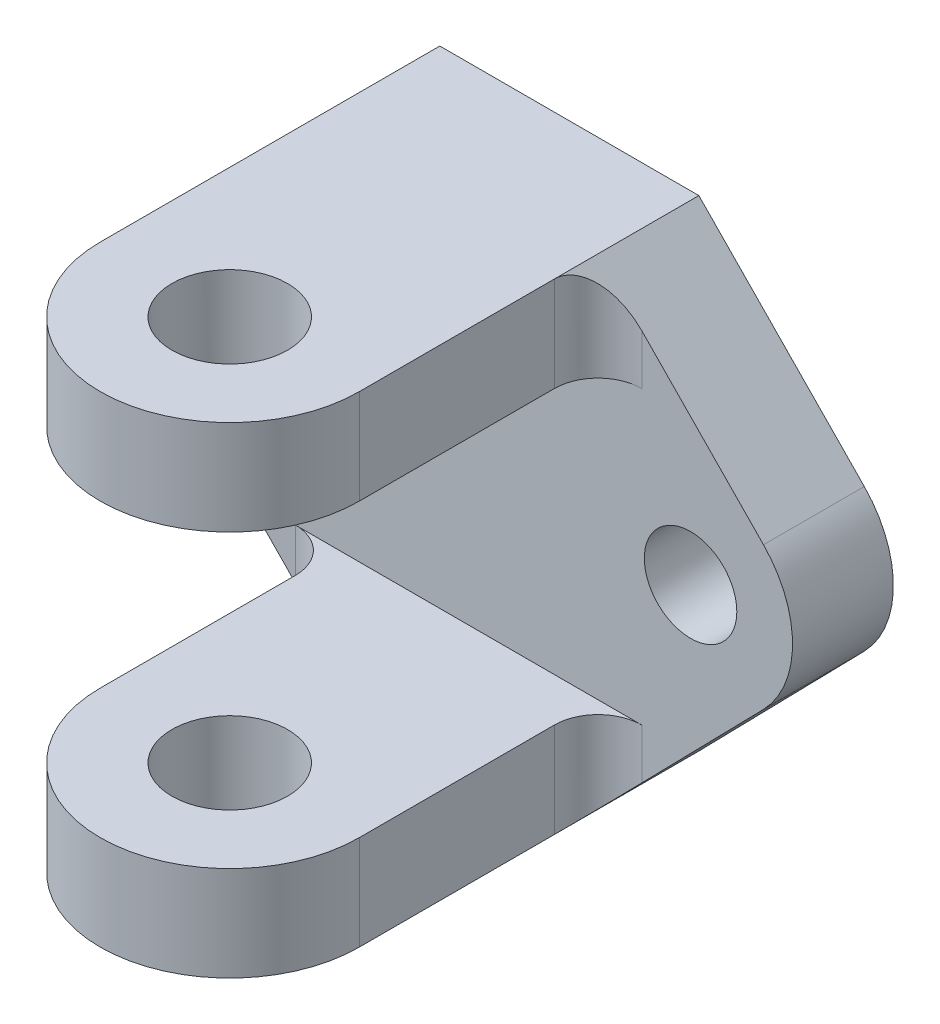
ISO-10303-21;
HEADER;
FILE_DESCRIPTION(('STEP AP214'),'2;1');
FILE_NAME('part.step','',(''),(''),'','','');
FILE_SCHEMA(('AUTOMOTIVE_DESIGN { 1 0 10303 214 1 1 1 1 }'));
ENDSEC;
DATA;
#1=APPLICATION_CONTEXT('core data for automotive mechanical design processes');
#2=APPLICATION_PROTOCOL_DEFINITION('international standard','automotive_design',2000,#1);
#3=PRODUCT_CONTEXT('',#1,'mechanical');
#4=PRODUCT('Part','Part','',(#3));
#5=PRODUCT_RELATED_PRODUCT_CATEGORY('part','',(#4));
#6=PRODUCT_DEFINITION_FORMATION('','',#4);
#7=PRODUCT_DEFINITION_CONTEXT('part definition',#1,'design');
#8=PRODUCT_DEFINITION('design','',#6,#7);
#9=PRODUCT_DEFINITION_SHAPE('','',#8);
#10=(LENGTH_UNIT() NAMED_UNIT(*) SI_UNIT(.MILLI.,.METRE.));
#11=(NAMED_UNIT(*) PLANE_ANGLE_UNIT() SI_UNIT($,.RADIAN.));
#12=(NAMED_UNIT(*) SI_UNIT($,.STERADIAN.) SOLID_ANGLE_UNIT());
#13=UNCERTAINTY_MEASURE_WITH_UNIT(LENGTH_MEASURE(1.E-05),#10,'distance_accuracy_value','');
#14=(GEOMETRIC_REPRESENTATION_CONTEXT(3) GLOBAL_UNCERTAINTY_ASSIGNED_CONTEXT((#13)) GLOBAL_UNIT_ASSIGNED_CONTEXT((#10,
#11,#12)) REPRESENTATION_CONTEXT('',''));
#15=CARTESIAN_POINT('',(0.,0.,0.));
#16=DIRECTION('',(0.,0.,1.));
#17=DIRECTION('',(1.,0.,0.));
#18=AXIS2_PLACEMENT_3D('',#15,#16,#17);
#19=CARTESIAN_POINT('',(-8.89,-87.0039032824825,0.));
#20=DIRECTION('',(1.,0.,0.));
#21=DIRECTION('',(0.,0.,-1.));
#22=AXIS2_PLACEMENT_3D('',#19,#20,#21);
#23=PLANE('',#22);
#24=DIRECTION('',(0.,0.,1.));
#25=VECTOR('',#24,1.);
#26=CARTESIAN_POINT('',(-8.89,16.51,0.));
#27=LINE('',#26,#25);
#28=CARTESIAN_POINT('',(-8.89,16.51,12.46));
#29=VERTEX_POINT('',#28);
#30=CARTESIAN_POINT('',(-8.89,16.51,25.8481308));
#31=VERTEX_POINT('',#30);
#32=EDGE_CURVE('E150',#29,#31,#27,.T.);
#33=ORIENTED_EDGE('',*,*,#32,.F.);
#34=DIRECTION('',(0.,1.,0.));
#35=VECTOR('',#34,1.);
#36=CARTESIAN_POINT('',(-8.89,9.99999999999999,12.46));
#37=LINE('',#36,#35);
#38=CARTESIAN_POINT('',(-8.89,10.,12.46));
#39=VERTEX_POINT('',#38);
#40=EDGE_CURVE('E143',#29,#39,#37,.F.);
#41=ORIENTED_EDGE('',*,*,#40,.T.);
#42=DIRECTION('',(0.,0.,-1.));
#43=VECTOR('',#42,1.);
#44=CARTESIAN_POINT('',(-8.88999999999999,10.,62.46));
#45=LINE('',#44,#43);
#46=CARTESIAN_POINT('',(-8.89,9.99999999999999,25.8481308));
#47=VERTEX_POINT('',#46);
#48=EDGE_CURVE('E147',#47,#39,#45,.T.);
#49=ORIENTED_EDGE('',*,*,#48,.F.);
#50=DIRECTION('',(0.,1.,0.));
#51=VECTOR('',#50,1.);
#52=CARTESIAN_POINT('',(-8.89,-87.0039032824825,25.8481308));
#53=LINE('',#52,#51);
#54=EDGE_CURVE('E296',#47,#31,#53,.T.);
#55=ORIENTED_EDGE('',*,*,#54,.T.);
#56=EDGE_LOOP('',(#33,#41,#49,#55));
#57=FACE_BOUND('',#56,.T.);
#58=ADVANCED_FACE('F43',(#57),#23,.F.);
#59=CARTESIAN_POINT('',(8.89,-87.0039032824825,0.));
#60=DIRECTION('',(1.,0.,0.));
#61=DIRECTION('',(0.,0.,-1.));
#62=AXIS2_PLACEMENT_3D('',#59,#60,#61);
#63=PLANE('',#62);
#64=DIRECTION('',(0.,0.,-1.));
#65=VECTOR('',#64,1.);
#66=CARTESIAN_POINT('',(8.89,10.,62.46));
#67=LINE('',#66,#65);
#68=CARTESIAN_POINT('',(8.89,9.99999999999999,25.8481308));
#69=VERTEX_POINT('',#68);
#70=CARTESIAN_POINT('',(8.89,10.,12.46));
#71=VERTEX_POINT('',#70);
#72=EDGE_CURVE('E166',#69,#71,#67,.T.);
#73=ORIENTED_EDGE('',*,*,#72,.T.);
#74=DIRECTION('',(0.,1.,0.));
#75=VECTOR('',#74,1.);
#76=CARTESIAN_POINT('',(8.89,-87.0039032824825,12.46));
#77=LINE('',#76,#75);
#78=CARTESIAN_POINT('',(8.89,16.51,12.46));
#79=VERTEX_POINT('',#78);
#80=EDGE_CURVE('E232',#71,#79,#77,.T.);
#81=ORIENTED_EDGE('',*,*,#80,.T.);
#82=DIRECTION('',(0.,0.,1.));
#83=VECTOR('',#82,1.);
#84=CARTESIAN_POINT('',(8.89,16.51,0.));
#85=LINE('',#84,#83);
#86=CARTESIAN_POINT('',(8.89,16.51,25.8481308));
#87=VERTEX_POINT('',#86);
#88=EDGE_CURVE('E293',#79,#87,#85,.T.);
#89=ORIENTED_EDGE('',*,*,#88,.T.);
#90=DIRECTION('',(0.,1.,0.));
#91=VECTOR('',#90,1.);
#92=CARTESIAN_POINT('',(8.89,-87.0039032824825,25.8481308));
#93=LINE('',#92,#91);
#94=EDGE_CURVE('E309',#69,#87,#93,.T.);
#95=ORIENTED_EDGE('',*,*,#94,.F.);
#96=EDGE_LOOP('',(#73,#81,#89,#95));
#97=FACE_BOUND('',#96,.T.);
#98=ADVANCED_FACE('F376',(#97),#63,.T.);
#99=CARTESIAN_POINT('',(15.24,0.,45.463373453053));
#100=DIRECTION('',(0.,0.,-1.));
#101=DIRECTION('',(-1.,0.,0.));
#102=AXIS2_PLACEMENT_3D('',#99,#100,#101);
#103=CYLINDRICAL_SURFACE('',#102,7.);
#104=CARTESIAN_POINT('',(15.24,0.,2.54));
#105=DIRECTION('',(0.,0.,1.));
#106=DIRECTION('',(1.,0.,0.));
#107=AXIS2_PLACEMENT_3D('',#104,#105,#106);
#108=CIRCLE('',#107,6.99999999999999);
#109=CARTESIAN_POINT('',(20.2456912582253,-4.89316411203698,2.54));
#110=VERTEX_POINT('',#109);
#111=CARTESIAN_POINT('',(20.2456912582253,4.89316411203699,2.54));
#112=VERTEX_POINT('',#111);
#113=EDGE_CURVE('E492',#110,#112,#108,.T.);
#114=ORIENTED_EDGE('',*,*,#113,.T.);
#115=DIRECTION('',(0.,0.,-1.));
#116=VECTOR('',#115,1.);
#117=CARTESIAN_POINT('',(20.2456912582253,4.89316411203699,25.7050792549621));
#118=LINE('',#117,#116);
#119=CARTESIAN_POINT('',(20.2456912582253,4.89316411203699,9.46));
#120=VERTEX_POINT('',#119);
#121=EDGE_CURVE('E209',#120,#112,#118,.T.);
#122=ORIENTED_EDGE('',*,*,#121,.F.);
#123=CARTESIAN_POINT('',(15.24,0.,9.46));
#124=DIRECTION('',(0.,0.,-1.));
#125=DIRECTION('',(-1.,0.,0.));
#126=AXIS2_PLACEMENT_3D('',#123,#124,#125);
#127=CIRCLE('',#126,7.);
#128=CARTESIAN_POINT('',(20.2456912582253,-4.89316411203699,9.46));
#129=VERTEX_POINT('',#128);
#130=EDGE_CURVE('E207',#129,#120,#127,.F.);
#131=ORIENTED_EDGE('',*,*,#130,.F.);
#132=DIRECTION('',(0.,0.,-1.));
#133=VECTOR('',#132,1.);
#134=CARTESIAN_POINT('',(20.2456912582253,-4.89316411203698,25.7050792549621));
#135=LINE('',#134,#133);
#136=EDGE_CURVE('E271',#129,#110,#135,.T.);
#137=ORIENTED_EDGE('',*,*,#136,.T.);
#138=EDGE_LOOP('',(#114,#122,#131,#137));
#139=FACE_BOUND('',#138,.T.);
#140=ADVANCED_FACE('F438',(#139),#103,.T.);
#141=DIRECTION('',(0.,0.,1.));
#142=VECTOR('',#141,1.);
#143=CARTESIAN_POINT('',(-8.88999999999999,-10.,62.46));
#144=LINE('',#143,#142);
#145=CARTESIAN_POINT('',(-8.89,-10.,12.46));
#146=VERTEX_POINT('',#145);
#147=CARTESIAN_POINT('',(-8.89,-10.,25.8481308));
#148=VERTEX_POINT('',#147);
#149=EDGE_CURVE('E244',#146,#148,#144,.T.);
#150=ORIENTED_EDGE('',*,*,#149,.F.);
#151=DIRECTION('',(0.,-1.,0.));
#152=VECTOR('',#151,1.);
#153=CARTESIAN_POINT('',(-8.89,-16.51,12.46));
#154=LINE('',#153,#152);
#155=CARTESIAN_POINT('',(-8.89,-16.51,12.46));
#156=VERTEX_POINT('',#155);
#157=EDGE_CURVE('E214',#146,#156,#154,.T.);
#158=ORIENTED_EDGE('',*,*,#157,.T.);
#159=DIRECTION('',(0.,0.,1.));
#160=VECTOR('',#159,1.);
#161=CARTESIAN_POINT('',(-8.89,-16.51,0.));
#162=LINE('',#161,#160);
#163=CARTESIAN_POINT('',(-8.89,-16.51,25.8481308));
#164=VERTEX_POINT('',#163);
#165=EDGE_CURVE('E304',#156,#164,#162,.T.);
#166=ORIENTED_EDGE('',*,*,#165,.T.);
#167=EDGE_CURVE('E255',#164,#148,#53,.T.);
#168=ORIENTED_EDGE('',*,*,#167,.T.);
#169=EDGE_LOOP('',(#150,#158,#166,#168));
#170=FACE_BOUND('',#169,.T.);
#171=ADVANCED_FACE('F251',(#170),#23,.F.);
#172=CARTESIAN_POINT('',(-15.24,0.,45.463373453053));
#173=DIRECTION('',(0.,0.,-1.));
#174=DIRECTION('',(-1.,0.,0.));
#175=AXIS2_PLACEMENT_3D('',#172,#173,#174);
#176=CYLINDRICAL_SURFACE('',#175,7.);
#177=DIRECTION('',(0.,0.,-1.));
#178=VECTOR('',#177,1.);
#179=CARTESIAN_POINT('',(-20.2456912582253,4.89316411203698,25.7050792549621));
#180=LINE('',#179,#178);
#181=CARTESIAN_POINT('',(-20.2456912582253,4.89316411203698,9.46));
#182=VERTEX_POINT('',#181);
#183=CARTESIAN_POINT('',(-20.2456912582253,4.89316411203698,2.54));
#184=VERTEX_POINT('',#183);
#185=EDGE_CURVE('E210',#182,#184,#180,.T.);
#186=ORIENTED_EDGE('',*,*,#185,.T.);
#187=CARTESIAN_POINT('',(-15.24,0.,2.54));
#188=DIRECTION('',(0.,0.,1.));
#189=DIRECTION('',(1.,0.,0.));
#190=AXIS2_PLACEMENT_3D('',#187,#188,#189);
#191=CIRCLE('',#190,7.);
#192=CARTESIAN_POINT('',(-20.2456912582253,-4.89316411203699,2.54));
#193=VERTEX_POINT('',#192);
#194=EDGE_CURVE('E59',#184,#193,#191,.T.);
#195=ORIENTED_EDGE('',*,*,#194,.T.);
#196=DIRECTION('',(0.,0.,-1.));
#197=VECTOR('',#196,1.);
#198=CARTESIAN_POINT('',(-20.2456912582253,-4.89316411203699,25.7050792549621));
#199=LINE('',#198,#197);
#200=CARTESIAN_POINT('',(-20.2456912582253,-4.89316411203699,9.46));
#201=VERTEX_POINT('',#200);
#202=EDGE_CURVE('E112',#201,#193,#199,.T.);
#203=ORIENTED_EDGE('',*,*,#202,.F.);
#204=CARTESIAN_POINT('',(-15.24,0.,9.46));
#205=DIRECTION('',(0.,0.,-1.));
#206=DIRECTION('',(-1.,0.,0.));
#207=AXIS2_PLACEMENT_3D('',#204,#205,#206);
#208=CIRCLE('',#207,7.);
#209=EDGE_CURVE('E266',#201,#182,#208,.T.);
#210=ORIENTED_EDGE('',*,*,#209,.T.);
#211=EDGE_LOOP('',(#186,#195,#203,#210));
#212=FACE_BOUND('',#211,.T.);
#213=ADVANCED_FACE('F430',(#212),#176,.T.);
#214=DIRECTION('',(0.,0.,1.));
#215=VECTOR('',#214,1.);
#216=CARTESIAN_POINT('',(8.89,-16.51,0.));
#217=LINE('',#216,#215);
#218=CARTESIAN_POINT('',(8.89,-16.51,12.46));
#219=VERTEX_POINT('',#218);
#220=CARTESIAN_POINT('',(8.89,-16.51,25.8481308));
#221=VERTEX_POINT('',#220);
#222=EDGE_CURVE('E300',#219,#221,#217,.T.);
#223=ORIENTED_EDGE('',*,*,#222,.F.);
#224=DIRECTION('',(0.,-1.,0.));
#225=VECTOR('',#224,1.);
#226=CARTESIAN_POINT('',(8.89,-87.0039032824825,12.46));
#227=LINE('',#226,#225);
#228=CARTESIAN_POINT('',(8.89,-9.99999999999999,12.46));
#229=VERTEX_POINT('',#228);
#230=EDGE_CURVE('E155',#219,#229,#227,.F.);
#231=ORIENTED_EDGE('',*,*,#230,.T.);
#232=DIRECTION('',(0.,0.,1.));
#233=VECTOR('',#232,1.);
#234=CARTESIAN_POINT('',(8.89,-9.99999999999999,62.46));
#235=LINE('',#234,#233);
#236=CARTESIAN_POINT('',(8.89,-9.99999999999999,25.8481308));
#237=VERTEX_POINT('',#236);
#238=EDGE_CURVE('E221',#229,#237,#235,.T.);
#239=ORIENTED_EDGE('',*,*,#238,.T.);
#240=EDGE_CURVE('E305',#221,#237,#93,.T.);
#241=ORIENTED_EDGE('',*,*,#240,.F.);
#242=EDGE_LOOP('',(#223,#231,#239,#241));
#243=FACE_BOUND('',#242,.T.);
#244=ADVANCED_FACE('F352',(#243),#63,.T.);
#245=CARTESIAN_POINT('',(-23.24,10.,62.46));
#246=DIRECTION('',(0.,1.,0.));
#247=DIRECTION('',(0.,0.,1.));
#248=AXIS2_PLACEMENT_3D('',#245,#246,#247);
#249=PLANE('',#248);
#250=CARTESIAN_POINT('',(0.,10.,25.8481308));
#251=DIRECTION('',(0.,1.,0.));
#252=DIRECTION('',(0.,0.,1.));
#253=AXIS2_PLACEMENT_3D('',#250,#251,#252);
#254=CIRCLE('',#253,3.96875);
#255=CARTESIAN_POINT('',(0.,10.,29.8168808));
#256=VERTEX_POINT('',#255);
#257=EDGE_CURVE('E327',#256,#256,#254,.T.);
#258=ORIENTED_EDGE('',*,*,#257,.T.);
#259=EDGE_LOOP('',(#258));
#260=FACE_BOUND('',#259,.T.);
#261=ORIENTED_EDGE('',*,*,#72,.F.);
#262=CARTESIAN_POINT('',(0.,9.99999999999999,25.8481308));
#263=DIRECTION('',(0.,1.,0.));
#264=DIRECTION('',(0.,0.,1.));
#265=AXIS2_PLACEMENT_3D('',#262,#263,#264);
#266=CIRCLE('',#265,8.89);
#267=EDGE_CURVE('E164',#47,#69,#266,.T.);
#268=ORIENTED_EDGE('',*,*,#267,.F.);
#269=ORIENTED_EDGE('',*,*,#48,.T.);
#270=CARTESIAN_POINT('',(-11.89,10.,12.46));
#271=DIRECTION('',(0.,1.,0.));
#272=DIRECTION('',(0.,0.,1.));
#273=AXIS2_PLACEMENT_3D('',#270,#271,#272);
#274=CIRCLE('',#273,3.);
#275=CARTESIAN_POINT('',(-11.89,10.,9.46));
#276=VERTEX_POINT('',#275);
#277=EDGE_CURVE('E161',#39,#276,#274,.T.);
#278=ORIENTED_EDGE('',*,*,#277,.T.);
#279=DIRECTION('',(1.,0.,0.));
#280=VECTOR('',#279,1.);
#281=CARTESIAN_POINT('',(-23.24,10.,9.46));
#282=LINE('',#281,#280);
#283=CARTESIAN_POINT('',(11.89,10.,9.46));
#284=VERTEX_POINT('',#283);
#285=EDGE_CURVE('E333',#276,#284,#282,.T.);
#286=ORIENTED_EDGE('',*,*,#285,.T.);
#287=CARTESIAN_POINT('',(11.89,9.99999999999999,12.46));
#288=DIRECTION('',(0.,1.,0.));
#289=DIRECTION('',(0.,0.,1.));
#290=AXIS2_PLACEMENT_3D('',#287,#288,#289);
#291=CIRCLE('',#290,3.);
#292=EDGE_CURVE('E11',#284,#71,#291,.T.);
#293=ORIENTED_EDGE('',*,*,#292,.T.);
#294=EDGE_LOOP('',(#261,#268,#269,#278,#286,#293));
#295=FACE_BOUND('',#294,.T.);
#296=ADVANCED_FACE('F160',(#260,#295),#249,.F.);
#297=CARTESIAN_POINT('',(-23.24,-10.,62.46));
#298=DIRECTION('',(0.,-1.,0.));
#299=DIRECTION('',(1.,0.,0.));
#300=AXIS2_PLACEMENT_3D('',#297,#298,#299);
#301=PLANE('',#300);
#302=CARTESIAN_POINT('',(0.,-9.99999999999999,25.8481308));
#303=DIRECTION('',(0.,-1.,0.));
#304=DIRECTION('',(1.,0.,0.));
#305=AXIS2_PLACEMENT_3D('',#302,#303,#304);
#306=CIRCLE('',#305,3.96875);
#307=CARTESIAN_POINT('',(3.96875,-9.99999999999999,25.8481308));
#308=VERTEX_POINT('',#307);
#309=EDGE_CURVE('E326',#308,#308,#306,.T.);
#310=ORIENTED_EDGE('',*,*,#309,.T.);
#311=EDGE_LOOP('',(#310));
#312=FACE_BOUND('',#311,.T.);
#313=ORIENTED_EDGE('',*,*,#238,.F.);
#314=CARTESIAN_POINT('',(11.89,-9.99999999999999,12.46));
#315=DIRECTION('',(0.,-1.,0.));
#316=DIRECTION('',(1.,0.,0.));
#317=AXIS2_PLACEMENT_3D('',#314,#315,#316);
#318=CIRCLE('',#317,3.);
#319=CARTESIAN_POINT('',(11.89,-9.99999999999999,9.46));
#320=VERTEX_POINT('',#319);
#321=EDGE_CURVE('E178',#229,#320,#318,.T.);
#322=ORIENTED_EDGE('',*,*,#321,.T.);
#323=DIRECTION('',(-1.,0.,0.));
#324=VECTOR('',#323,1.);
#325=CARTESIAN_POINT('',(-23.24,-10.,9.46));
#326=LINE('',#325,#324);
#327=CARTESIAN_POINT('',(-11.89,-10.,9.46));
#328=VERTEX_POINT('',#327);
#329=EDGE_CURVE('E246',#320,#328,#326,.T.);
#330=ORIENTED_EDGE('',*,*,#329,.T.);
#331=CARTESIAN_POINT('',(-11.89,-10.,12.46));
#332=DIRECTION('',(0.,-1.,0.));
#333=DIRECTION('',(1.,0.,0.));
#334=AXIS2_PLACEMENT_3D('',#331,#332,#333);
#335=CIRCLE('',#334,3.);
#336=EDGE_CURVE('E180',#328,#146,#335,.T.);
#337=ORIENTED_EDGE('',*,*,#336,.T.);
#338=ORIENTED_EDGE('',*,*,#149,.T.);
#339=CARTESIAN_POINT('',(0.,-9.99999999999999,25.8481308));
#340=DIRECTION('',(0.,-1.,0.));
#341=DIRECTION('',(1.,0.,0.));
#342=AXIS2_PLACEMENT_3D('',#339,#340,#341);
#343=CIRCLE('',#342,8.89);
#344=EDGE_CURVE('E258',#237,#148,#343,.T.);
#345=ORIENTED_EDGE('',*,*,#344,.F.);
#346=EDGE_LOOP('',(#313,#322,#330,#337,#338,#345));
#347=FACE_BOUND('',#346,.T.);
#348=ADVANCED_FACE('F242',(#312,#347),#301,.F.);
#349=CARTESIAN_POINT('',(0.,0.,9.46));
#350=DIRECTION('',(0.,0.,-1.));
#351=DIRECTION('',(-1.,0.,0.));
#352=AXIS2_PLACEMENT_3D('',#349,#350,#351);
#353=PLANE('',#352);
#354=DIRECTION('',(0.699023444576713,-0.715098751175044,0.));
#355=VECTOR('',#354,1.);
#356=CARTESIAN_POINT('',(-12.7989125109506,-12.5111949860624,9.46));
#357=LINE('',#356,#355);
#358=CARTESIAN_POINT('',(-11.89,-13.4410095817685,9.46));
#359=VERTEX_POINT('',#358);
#360=EDGE_CURVE('E264',#201,#359,#357,.T.);
#361=ORIENTED_EDGE('',*,*,#360,.T.);
#362=DIRECTION('',(0.,-1.,0.));
#363=VECTOR('',#362,1.);
#364=CARTESIAN_POINT('',(-11.89,-9.99999999999999,9.46));
#365=LINE('',#364,#363);
#366=EDGE_CURVE('E156',#359,#328,#365,.F.);
#367=ORIENTED_EDGE('',*,*,#366,.T.);
#368=ORIENTED_EDGE('',*,*,#329,.F.);
#369=DIRECTION('',(0.,-1.,0.));
#370=VECTOR('',#369,1.);
#371=CARTESIAN_POINT('',(11.89,0.,9.46));
#372=LINE('',#371,#370);
#373=CARTESIAN_POINT('',(11.89,-13.4410095817685,9.46));
#374=VERTEX_POINT('',#373);
#375=EDGE_CURVE('E213',#320,#374,#372,.T.);
#376=ORIENTED_EDGE('',*,*,#375,.T.);
#377=DIRECTION('',(-0.699023444576713,-0.715098751175044,0.));
#378=VECTOR('',#377,1.);
#379=CARTESIAN_POINT('',(12.7989125109506,-12.5111949860624,9.46));
#380=LINE('',#379,#378);
#381=EDGE_CURVE('E275',#129,#374,#380,.T.);
#382=ORIENTED_EDGE('',*,*,#381,.F.);
#383=ORIENTED_EDGE('',*,*,#130,.T.);
#384=DIRECTION('',(-0.699023444576713,0.715098751175044,0.));
#385=VECTOR('',#384,1.);
#386=CARTESIAN_POINT('',(8.89,16.51,9.46));
#387=LINE('',#386,#385);
#388=CARTESIAN_POINT('',(11.89,13.4410095817685,9.46));
#389=VERTEX_POINT('',#388);
#390=EDGE_CURVE('E192',#120,#389,#387,.T.);
#391=ORIENTED_EDGE('',*,*,#390,.T.);
#392=DIRECTION('',(0.,1.,0.));
#393=VECTOR('',#392,1.);
#394=CARTESIAN_POINT('',(11.89,0.,9.46));
#395=LINE('',#394,#393);
#396=EDGE_CURVE('E204',#389,#284,#395,.F.);
#397=ORIENTED_EDGE('',*,*,#396,.T.);
#398=ORIENTED_EDGE('',*,*,#285,.F.);
#399=DIRECTION('',(0.,1.,0.));
#400=VECTOR('',#399,1.);
#401=CARTESIAN_POINT('',(-11.89,16.51,9.46));
#402=LINE('',#401,#400);
#403=CARTESIAN_POINT('',(-11.89,13.4410095817685,9.46));
#404=VERTEX_POINT('',#403);
#405=EDGE_CURVE('E170',#276,#404,#402,.T.);
#406=ORIENTED_EDGE('',*,*,#405,.T.);
#407=DIRECTION('',(0.699023444576713,0.715098751175044,0.));
#408=VECTOR('',#407,1.);
#409=CARTESIAN_POINT('',(-8.89,16.51,9.46));
#410=LINE('',#409,#408);
#411=EDGE_CURVE('E424',#182,#404,#410,.T.);
#412=ORIENTED_EDGE('',*,*,#411,.F.);
#413=ORIENTED_EDGE('',*,*,#209,.F.);
#414=EDGE_LOOP('',(#361,#367,#368,#376,#382,#383,#391,#397,#398,#406,#412,#413));
#415=FACE_BOUND('',#414,.T.);
#416=CARTESIAN_POINT('',(15.24,0.,9.46));
#417=DIRECTION('',(0.,0.,1.));
#418=DIRECTION('',(1.,0.,0.));
#419=AXIS2_PLACEMENT_3D('',#416,#417,#418);
#420=CIRCLE('',#419,3.175);
#421=CARTESIAN_POINT('',(18.415,0.,9.46));
#422=VERTEX_POINT('',#421);
#423=EDGE_CURVE('E259',#422,#422,#420,.T.);
#424=ORIENTED_EDGE('',*,*,#423,.F.);
#425=EDGE_LOOP('',(#424));
#426=FACE_BOUND('',#425,.T.);
#427=CARTESIAN_POINT('',(-15.24,0.,9.46));
#428=DIRECTION('',(0.,0.,1.));
#429=DIRECTION('',(1.,0.,0.));
#430=AXIS2_PLACEMENT_3D('',#427,#428,#429);
#431=CIRCLE('',#430,3.175);
#432=CARTESIAN_POINT('',(-12.065,0.,9.46));
#433=VERTEX_POINT('',#432);
#434=EDGE_CURVE('E336',#433,#433,#431,.T.);
#435=ORIENTED_EDGE('',*,*,#434,.F.);
#436=EDGE_LOOP('',(#435));
#437=FACE_BOUND('',#436,.T.);
#438=ADVANCED_FACE('F202',(#415,#426,#437),#353,.F.);
#439=CARTESIAN_POINT('',(-23.24,16.51,9.46));
#440=DIRECTION('',(0.,-1.,0.));
#441=DIRECTION('',(0.,0.,-1.));
#442=AXIS2_PLACEMENT_3D('',#439,#440,#441);
#443=PLANE('',#442);
#444=CARTESIAN_POINT('',(0.,16.51,25.8481308));
#445=DIRECTION('',(0.,-1.,0.));
#446=DIRECTION('',(0.,0.,-1.));
#447=AXIS2_PLACEMENT_3D('',#444,#445,#446);
#448=CIRCLE('',#447,3.96875);
#449=CARTESIAN_POINT('',(0.,16.51,21.8793808));
#450=VERTEX_POINT('',#449);
#451=EDGE_CURVE('E318',#450,#450,#448,.T.);
#452=ORIENTED_EDGE('',*,*,#451,.T.);
#453=EDGE_LOOP('',(#452));
#454=FACE_BOUND('',#453,.T.);
#455=CARTESIAN_POINT('',(8.89,16.51,2.54));
#456=VERTEX_POINT('',#455);
#457=EDGE_CURVE('E80',#456,#79,#85,.T.);
#458=ORIENTED_EDGE('',*,*,#457,.F.);
#459=DIRECTION('',(-1.,0.,0.));
#460=VECTOR('',#459,1.);
#461=CARTESIAN_POINT('',(8.89,16.51,2.54));
#462=LINE('',#461,#460);
#463=CARTESIAN_POINT('',(-8.89,16.51,2.54));
#464=VERTEX_POINT('',#463);
#465=EDGE_CURVE('E414',#456,#464,#462,.T.);
#466=ORIENTED_EDGE('',*,*,#465,.T.);
#467=EDGE_CURVE('E286',#464,#29,#27,.T.);
#468=ORIENTED_EDGE('',*,*,#467,.T.);
#469=ORIENTED_EDGE('',*,*,#32,.T.);
#470=CARTESIAN_POINT('',(0.,16.51,25.8481308));
#471=DIRECTION('',(0.,-1.,0.));
#472=DIRECTION('',(0.,0.,-1.));
#473=AXIS2_PLACEMENT_3D('',#470,#471,#472);
#474=CIRCLE('',#473,8.89);
#475=EDGE_CURVE('E289',#87,#31,#474,.T.);
#476=ORIENTED_EDGE('',*,*,#475,.F.);
#477=ORIENTED_EDGE('',*,*,#88,.F.);
#478=EDGE_LOOP('',(#458,#466,#468,#469,#476,#477));
#479=FACE_BOUND('',#478,.T.);
#480=ADVANCED_FACE('F384',(#454,#479),#443,.F.);
#481=CARTESIAN_POINT('',(-23.24,-16.51,9.46));
#482=DIRECTION('',(0.,1.,0.));
#483=DIRECTION('',(0.,0.,1.));
#484=AXIS2_PLACEMENT_3D('',#481,#482,#483);
#485=PLANE('',#484);
#486=CARTESIAN_POINT('',(-8.89,-16.51,2.54));
#487=VERTEX_POINT('',#486);
#488=EDGE_CURVE('E101',#487,#156,#162,.T.);
#489=ORIENTED_EDGE('',*,*,#488,.F.);
#490=DIRECTION('',(1.,0.,0.));
#491=VECTOR('',#490,1.);
#492=CARTESIAN_POINT('',(-8.89,-16.51,2.54));
#493=LINE('',#492,#491);
#494=CARTESIAN_POINT('',(8.89,-16.51,2.54));
#495=VERTEX_POINT('',#494);
#496=EDGE_CURVE('E755',#487,#495,#493,.T.);
#497=ORIENTED_EDGE('',*,*,#496,.T.);
#498=EDGE_CURVE('E68',#495,#219,#217,.T.);
#499=ORIENTED_EDGE('',*,*,#498,.T.);
#500=ORIENTED_EDGE('',*,*,#222,.T.);
#501=CARTESIAN_POINT('',(0.,-16.51,25.8481308));
#502=DIRECTION('',(0.,1.,0.));
#503=DIRECTION('',(0.,0.,1.));
#504=AXIS2_PLACEMENT_3D('',#501,#502,#503);
#505=CIRCLE('',#504,8.89);
#506=EDGE_CURVE('E299',#221,#164,#505,.F.);
#507=ORIENTED_EDGE('',*,*,#506,.T.);
#508=ORIENTED_EDGE('',*,*,#165,.F.);
#509=EDGE_LOOP('',(#489,#497,#499,#500,#507,#508));
#510=FACE_BOUND('',#509,.T.);
#511=CARTESIAN_POINT('',(0.,-16.51,25.8481308));
#512=DIRECTION('',(0.,1.,0.));
#513=DIRECTION('',(0.,0.,1.));
#514=AXIS2_PLACEMENT_3D('',#511,#512,#513);
#515=CIRCLE('',#514,3.96875);
#516=CARTESIAN_POINT('',(0.,-16.51,29.8168808));
#517=VERTEX_POINT('',#516);
#518=EDGE_CURVE('E322',#517,#517,#515,.F.);
#519=ORIENTED_EDGE('',*,*,#518,.F.);
#520=EDGE_LOOP('',(#519));
#521=FACE_BOUND('',#520,.T.);
#522=ADVANCED_FACE('F363',(#510,#521),#485,.F.);
#523=CARTESIAN_POINT('',(15.24,0.,9.46));
#524=DIRECTION('',(0.,0.,-1.));
#525=DIRECTION('',(-1.,0.,0.));
#526=AXIS2_PLACEMENT_3D('',#523,#524,#525);
#527=CYLINDRICAL_SURFACE('',#526,3.175);
#528=CARTESIAN_POINT('',(15.24,0.,2.54));
#529=DIRECTION('',(0.,0.,1.));
#530=DIRECTION('',(1.,0.,0.));
#531=AXIS2_PLACEMENT_3D('',#528,#529,#530);
#532=CIRCLE('',#531,3.175);
#533=CARTESIAN_POINT('',(18.415,0.,2.54));
#534=VERTEX_POINT('',#533);
#535=EDGE_CURVE('E426',#534,#534,#532,.T.);
#536=ORIENTED_EDGE('',*,*,#535,.F.);
#537=EDGE_LOOP('',(#536));
#538=FACE_BOUND('',#537,.T.);
#539=ORIENTED_EDGE('',*,*,#423,.T.);
#540=EDGE_LOOP('',(#539));
#541=FACE_BOUND('',#540,.T.);
#542=ADVANCED_FACE('F464',(#538,#541),#527,.F.);
#543=CARTESIAN_POINT('',(-15.24,0.,9.46));
#544=DIRECTION('',(0.,0.,-1.));
#545=DIRECTION('',(-1.,0.,0.));
#546=AXIS2_PLACEMENT_3D('',#543,#544,#545);
#547=CYLINDRICAL_SURFACE('',#546,3.175);
#548=CARTESIAN_POINT('',(-15.24,0.,2.54));
#549=DIRECTION('',(0.,0.,1.));
#550=DIRECTION('',(1.,0.,0.));
#551=AXIS2_PLACEMENT_3D('',#548,#549,#550);
#552=CIRCLE('',#551,3.175);
#553=CARTESIAN_POINT('',(-12.065,0.,2.54));
#554=VERTEX_POINT('',#553);
#555=EDGE_CURVE('E495',#554,#554,#552,.T.);
#556=ORIENTED_EDGE('',*,*,#555,.F.);
#557=EDGE_LOOP('',(#556));
#558=FACE_BOUND('',#557,.T.);
#559=ORIENTED_EDGE('',*,*,#434,.T.);
#560=EDGE_LOOP('',(#559));
#561=FACE_BOUND('',#560,.T.);
#562=ADVANCED_FACE('F461',(#558,#561),#547,.F.);
#563=CARTESIAN_POINT('',(0.,-27.7353201513364,25.8481308));
#564=DIRECTION('',(0.,1.,0.));
#565=DIRECTION('',(0.,0.,1.));
#566=AXIS2_PLACEMENT_3D('',#563,#564,#565);
#567=CYLINDRICAL_SURFACE('',#566,3.96875);
#568=ORIENTED_EDGE('',*,*,#518,.T.);
#569=EDGE_LOOP('',(#568));
#570=FACE_BOUND('',#569,.T.);
#571=ORIENTED_EDGE('',*,*,#309,.F.);
#572=EDGE_LOOP('',(#571));
#573=FACE_BOUND('',#572,.T.);
#574=ADVANCED_FACE('F453',(#570,#573),#567,.F.);
#575=ORIENTED_EDGE('',*,*,#451,.F.);
#576=EDGE_LOOP('',(#575));
#577=FACE_BOUND('',#576,.T.);
#578=ORIENTED_EDGE('',*,*,#257,.F.);
#579=EDGE_LOOP('',(#578));
#580=FACE_BOUND('',#579,.T.);
#581=ADVANCED_FACE('F450',(#577,#580),#567,.F.);
#582=CARTESIAN_POINT('',(0.,-87.0039032824825,25.8481308));
#583=DIRECTION('',(0.,1.,0.));
#584=DIRECTION('',(0.,0.,1.));
#585=AXIS2_PLACEMENT_3D('',#582,#583,#584);
#586=CYLINDRICAL_SURFACE('',#585,8.89);
#587=ORIENTED_EDGE('',*,*,#344,.T.);
#588=ORIENTED_EDGE('',*,*,#167,.F.);
#589=ORIENTED_EDGE('',*,*,#506,.F.);
#590=ORIENTED_EDGE('',*,*,#240,.T.);
#591=EDGE_LOOP('',(#587,#588,#589,#590));
#592=FACE_BOUND('',#591,.T.);
#593=ADVANCED_FACE('F359',(#592),#586,.T.);
#594=ORIENTED_EDGE('',*,*,#267,.T.);
#595=ORIENTED_EDGE('',*,*,#94,.T.);
#596=ORIENTED_EDGE('',*,*,#475,.T.);
#597=ORIENTED_EDGE('',*,*,#54,.F.);
#598=EDGE_LOOP('',(#594,#595,#596,#597));
#599=FACE_BOUND('',#598,.T.);
#600=ADVANCED_FACE('F371',(#599),#586,.T.);
#601=CARTESIAN_POINT('',(12.7989125109506,-12.5111949860624,25.7050792549621));
#602=DIRECTION('',(-0.715098751175044,0.699023444576713,0.));
#603=DIRECTION('',(-0.699023444576713,-0.715098751175044,0.));
#604=AXIS2_PLACEMENT_3D('',#601,#602,#603);
#605=PLANE('',#604);
#606=ORIENTED_EDGE('',*,*,#498,.F.);
#607=DIRECTION('',(0.699023444576713,0.715098751175044,0.));
#608=VECTOR('',#607,1.);
#609=CARTESIAN_POINT('',(8.89,-16.51,2.54));
#610=LINE('',#609,#608);
#611=EDGE_CURVE('E489',#495,#110,#610,.T.);
#612=ORIENTED_EDGE('',*,*,#611,.T.);
#613=ORIENTED_EDGE('',*,*,#136,.F.);
#614=ORIENTED_EDGE('',*,*,#381,.T.);
#615=CARTESIAN_POINT('',(11.89,-13.4410095817685,12.46));
#616=DIRECTION('',(-0.715098751175044,0.699023444576713,0.));
#617=DIRECTION('',(-0.699023444576713,-0.715098751175044,0.));
#618=AXIS2_PLACEMENT_3D('',#615,#616,#617);
#619=ELLIPSE('',#618,4.29170154917568,3.);
#620=EDGE_CURVE('E172',#374,#219,#619,.T.);
#621=ORIENTED_EDGE('',*,*,#620,.T.);
#622=EDGE_LOOP('',(#606,#612,#613,#614,#621));
#623=FACE_BOUND('',#622,.T.);
#624=ADVANCED_FACE('F449',(#623),#605,.F.);
#625=CARTESIAN_POINT('',(-12.7989125109506,-12.5111949860624,25.7050792549621));
#626=DIRECTION('',(-0.715098751175044,-0.699023444576713,0.));
#627=DIRECTION('',(0.699023444576713,-0.715098751175044,0.));
#628=AXIS2_PLACEMENT_3D('',#625,#626,#627);
#629=PLANE('',#628);
#630=DIRECTION('',(0.699023444576713,-0.715098751175044,0.));
#631=VECTOR('',#630,1.);
#632=CARTESIAN_POINT('',(-20.2456912582253,-4.89316411203699,2.54));
#633=LINE('',#632,#631);
#634=EDGE_CURVE('E758',#193,#487,#633,.T.);
#635=ORIENTED_EDGE('',*,*,#634,.T.);
#636=ORIENTED_EDGE('',*,*,#488,.T.);
#637=CARTESIAN_POINT('',(-11.89,-13.4410095817685,12.46));
#638=DIRECTION('',(-0.715098751175044,-0.699023444576713,0.));
#639=DIRECTION('',(-0.699023444576713,0.715098751175044,0.));
#640=AXIS2_PLACEMENT_3D('',#637,#638,#639);
#641=ELLIPSE('',#640,4.29170154917568,3.);
#642=EDGE_CURVE('E235',#156,#359,#641,.F.);
#643=ORIENTED_EDGE('',*,*,#642,.T.);
#644=ORIENTED_EDGE('',*,*,#360,.F.);
#645=ORIENTED_EDGE('',*,*,#202,.T.);
#646=EDGE_LOOP('',(#635,#636,#643,#644,#645));
#647=FACE_BOUND('',#646,.T.);
#648=ADVANCED_FACE('F263',(#647),#629,.T.);
#649=CARTESIAN_POINT('',(8.89,16.51,25.7050792549621));
#650=DIRECTION('',(0.715098751175044,0.699023444576713,0.));
#651=DIRECTION('',(-0.699023444576713,0.715098751175044,0.));
#652=AXIS2_PLACEMENT_3D('',#649,#650,#651);
#653=PLANE('',#652);
#654=DIRECTION('',(-0.699023444576713,0.715098751175044,0.));
#655=VECTOR('',#654,1.);
#656=CARTESIAN_POINT('',(20.2456912582253,4.89316411203699,2.54));
#657=LINE('',#656,#655);
#658=EDGE_CURVE('E493',#112,#456,#657,.T.);
#659=ORIENTED_EDGE('',*,*,#658,.T.);
#660=ORIENTED_EDGE('',*,*,#457,.T.);
#661=CARTESIAN_POINT('',(11.89,13.4410095817685,12.46));
#662=DIRECTION('',(0.715098751175044,0.699023444576713,0.));
#663=DIRECTION('',(-0.699023444576713,0.715098751175044,0.));
#664=AXIS2_PLACEMENT_3D('',#661,#662,#663);
#665=ELLIPSE('',#664,4.29170154917568,3.);
#666=EDGE_CURVE('E52',#79,#389,#665,.F.);
#667=ORIENTED_EDGE('',*,*,#666,.T.);
#668=ORIENTED_EDGE('',*,*,#390,.F.);
#669=ORIENTED_EDGE('',*,*,#121,.T.);
#670=EDGE_LOOP('',(#659,#660,#667,#668,#669));
#671=FACE_BOUND('',#670,.T.);
#672=ADVANCED_FACE('F189',(#671),#653,.T.);
#673=CARTESIAN_POINT('',(-8.89,16.51,25.7050792549621));
#674=DIRECTION('',(0.715098751175044,-0.699023444576713,0.));
#675=DIRECTION('',(0.699023444576713,0.715098751175044,0.));
#676=AXIS2_PLACEMENT_3D('',#673,#674,#675);
#677=PLANE('',#676);
#678=ORIENTED_EDGE('',*,*,#467,.F.);
#679=DIRECTION('',(-0.699023444576713,-0.715098751175044,0.));
#680=VECTOR('',#679,1.);
#681=CARTESIAN_POINT('',(-8.89,16.51,2.54));
#682=LINE('',#681,#680);
#683=EDGE_CURVE('E412',#464,#184,#682,.T.);
#684=ORIENTED_EDGE('',*,*,#683,.T.);
#685=ORIENTED_EDGE('',*,*,#185,.F.);
#686=ORIENTED_EDGE('',*,*,#411,.T.);
#687=CARTESIAN_POINT('',(-11.89,13.4410095817685,12.46));
#688=DIRECTION('',(0.715098751175044,-0.699023444576713,0.));
#689=DIRECTION('',(-0.699023444576713,-0.715098751175044,0.));
#690=AXIS2_PLACEMENT_3D('',#687,#688,#689);
#691=ELLIPSE('',#690,4.29170154917568,3.);
#692=EDGE_CURVE('E173',#404,#29,#691,.T.);
#693=ORIENTED_EDGE('',*,*,#692,.T.);
#694=EDGE_LOOP('',(#678,#684,#685,#686,#693));
#695=FACE_BOUND('',#694,.T.);
#696=ADVANCED_FACE('F422',(#695),#677,.F.);
#697=CARTESIAN_POINT('',(-11.89,-87.0039032824825,12.46));
#698=DIRECTION('',(0.,1.,0.));
#699=DIRECTION('',(0.,0.,1.));
#700=AXIS2_PLACEMENT_3D('',#697,#698,#699);
#701=CYLINDRICAL_SURFACE('',#700,3.);
#702=ORIENTED_EDGE('',*,*,#336,.F.);
#703=ORIENTED_EDGE('',*,*,#366,.F.);
#704=ORIENTED_EDGE('',*,*,#642,.F.);
#705=ORIENTED_EDGE('',*,*,#157,.F.);
#706=EDGE_LOOP('',(#702,#703,#704,#705));
#707=FACE_BOUND('',#706,.T.);
#708=ADVANCED_FACE('F261',(#707),#701,.F.);
#709=CARTESIAN_POINT('',(-11.89,0.,12.46));
#710=DIRECTION('',(0.,-1.,0.));
#711=DIRECTION('',(0.,0.,-1.));
#712=AXIS2_PLACEMENT_3D('',#709,#710,#711);
#713=CYLINDRICAL_SURFACE('',#712,3.);
#714=ORIENTED_EDGE('',*,*,#277,.F.);
#715=ORIENTED_EDGE('',*,*,#40,.F.);
#716=ORIENTED_EDGE('',*,*,#692,.F.);
#717=ORIENTED_EDGE('',*,*,#405,.F.);
#718=EDGE_LOOP('',(#714,#715,#716,#717));
#719=FACE_BOUND('',#718,.T.);
#720=ADVANCED_FACE('F168',(#719),#713,.F.);
#721=CARTESIAN_POINT('',(11.89,0.,12.46));
#722=DIRECTION('',(0.,-1.,0.));
#723=DIRECTION('',(0.,0.,-1.));
#724=AXIS2_PLACEMENT_3D('',#721,#722,#723);
#725=CYLINDRICAL_SURFACE('',#724,3.);
#726=ORIENTED_EDGE('',*,*,#321,.F.);
#727=ORIENTED_EDGE('',*,*,#230,.F.);
#728=ORIENTED_EDGE('',*,*,#620,.F.);
#729=ORIENTED_EDGE('',*,*,#375,.F.);
#730=EDGE_LOOP('',(#726,#727,#728,#729));
#731=FACE_BOUND('',#730,.T.);
#732=ADVANCED_FACE('F479',(#731),#725,.F.);
#733=CARTESIAN_POINT('',(11.89,-87.0039032824825,12.46));
#734=DIRECTION('',(0.,1.,0.));
#735=DIRECTION('',(0.,0.,1.));
#736=AXIS2_PLACEMENT_3D('',#733,#734,#735);
#737=CYLINDRICAL_SURFACE('',#736,3.);
#738=ORIENTED_EDGE('',*,*,#292,.F.);
#739=ORIENTED_EDGE('',*,*,#396,.F.);
#740=ORIENTED_EDGE('',*,*,#666,.F.);
#741=ORIENTED_EDGE('',*,*,#80,.F.);
#742=EDGE_LOOP('',(#738,#739,#740,#741));
#743=FACE_BOUND('',#742,.T.);
#744=ADVANCED_FACE('F45',(#743),#737,.F.);
#745=CARTESIAN_POINT('',(-15.24,0.,2.54));
#746=DIRECTION('',(0.,0.,1.));
#747=DIRECTION('',(1.,0.,0.));
#748=AXIS2_PLACEMENT_3D('',#745,#746,#747);
#749=PLANE('',#748);
#750=ORIENTED_EDGE('',*,*,#535,.T.);
#751=EDGE_LOOP('',(#750));
#752=FACE_BOUND('',#751,.T.);
#753=ORIENTED_EDGE('',*,*,#555,.T.);
#754=EDGE_LOOP('',(#753));
#755=FACE_BOUND('',#754,.T.);
#756=ORIENTED_EDGE('',*,*,#465,.F.);
#757=ORIENTED_EDGE('',*,*,#658,.F.);
#758=ORIENTED_EDGE('',*,*,#113,.F.);
#759=ORIENTED_EDGE('',*,*,#611,.F.);
#760=ORIENTED_EDGE('',*,*,#496,.F.);
#761=ORIENTED_EDGE('',*,*,#634,.F.);
#762=ORIENTED_EDGE('',*,*,#194,.F.);
#763=ORIENTED_EDGE('',*,*,#683,.F.);
#764=EDGE_LOOP('',(#756,#757,#758,#759,#760,#761,#762,#763));
#765=FACE_BOUND('',#764,.T.);
#766=ADVANCED_FACE('F413',(#752,#755,#765),#749,.F.);
#767=CLOSED_SHELL('',(#58,#98,#140,#171,#213,#244,#296,#348,#438,#480,#522,#542,#562,#574,#581,
#593,#600,#624,#648,#672,#696,#708,#720,#732,#744,#766));
#768=MANIFOLD_SOLID_BREP('B2',#767);
#769=ADVANCED_BREP_SHAPE_REPRESENTATION('',(#18,#768),#14);
#770=SHAPE_DEFINITION_REPRESENTATION(#9,#769);
ENDSEC;
END-ISO-10303-21;
